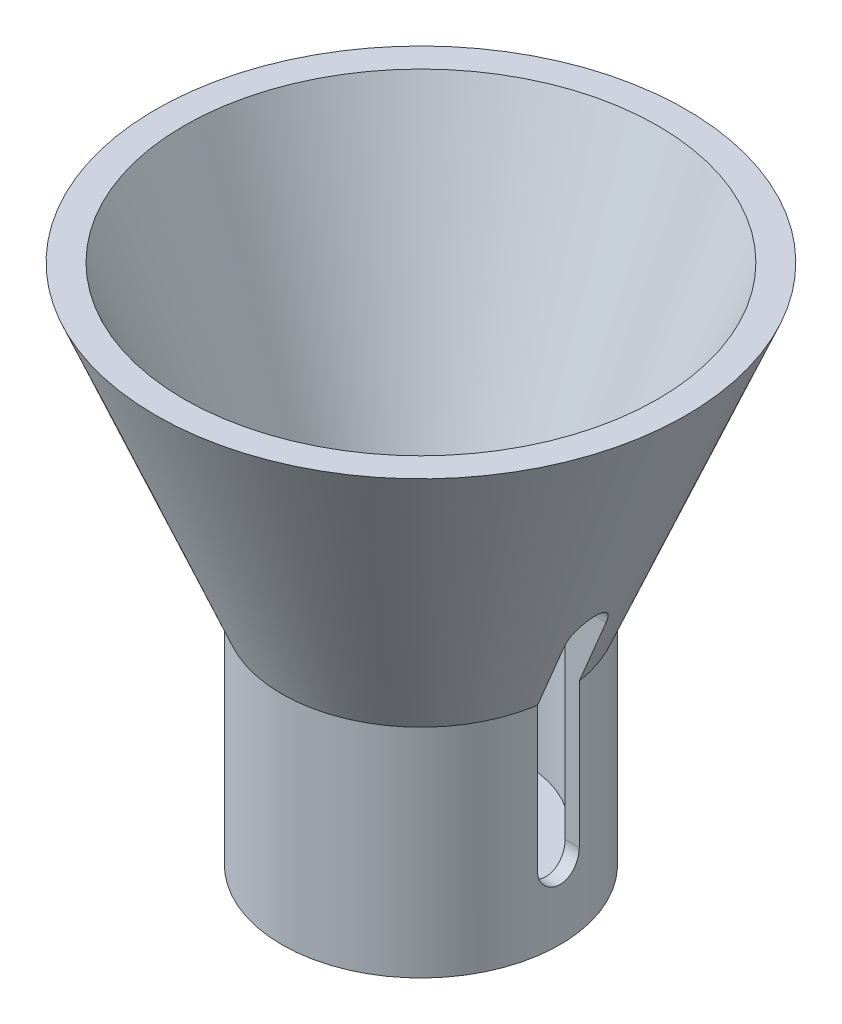
ISO-10303-21;
HEADER;
FILE_DESCRIPTION(('STEP AP214'),'2;1');
FILE_NAME('part.step','',(''),(''),'','','');
FILE_SCHEMA(('AUTOMOTIVE_DESIGN { 1 0 10303 214 1 1 1 1 }'));
ENDSEC;
DATA;
#1=APPLICATION_CONTEXT('core data for automotive mechanical design processes');
#2=APPLICATION_PROTOCOL_DEFINITION('international standard','automotive_design',2000,#1);
#3=PRODUCT_CONTEXT('',#1,'mechanical');
#4=PRODUCT('Part','Part','',(#3));
#5=PRODUCT_RELATED_PRODUCT_CATEGORY('part','',(#4));
#6=PRODUCT_DEFINITION_FORMATION('','',#4);
#7=PRODUCT_DEFINITION_CONTEXT('part definition',#1,'design');
#8=PRODUCT_DEFINITION('design','',#6,#7);
#9=PRODUCT_DEFINITION_SHAPE('','',#8);
#10=(LENGTH_UNIT() NAMED_UNIT(*) SI_UNIT(.MILLI.,.METRE.));
#11=(NAMED_UNIT(*) PLANE_ANGLE_UNIT() SI_UNIT($,.RADIAN.));
#12=(NAMED_UNIT(*) SI_UNIT($,.STERADIAN.) SOLID_ANGLE_UNIT());
#13=UNCERTAINTY_MEASURE_WITH_UNIT(LENGTH_MEASURE(1.E-05),#10,'distance_accuracy_value','');
#14=(GEOMETRIC_REPRESENTATION_CONTEXT(3) GLOBAL_UNCERTAINTY_ASSIGNED_CONTEXT((#13)) GLOBAL_UNIT_ASSIGNED_CONTEXT((#10,
#11,#12)) REPRESENTATION_CONTEXT('',''));
#15=CARTESIAN_POINT('',(0.,0.,0.));
#16=DIRECTION('',(0.,0.,1.));
#17=DIRECTION('',(1.,0.,0.));
#18=AXIS2_PLACEMENT_3D('',#15,#16,#17);
#19=CARTESIAN_POINT('',(0.,0.,0.));
#20=DIRECTION('',(0.,1.,0.));
#21=DIRECTION('',(0.,0.,1.));
#22=AXIS2_PLACEMENT_3D('',#19,#20,#21);
#23=CYLINDRICAL_SURFACE('',#22,25.4);
#24=CARTESIAN_POINT('',(0.,0.,0.));
#25=DIRECTION('',(0.,1.,0.));
#26=DIRECTION('',(0.,0.,1.));
#27=AXIS2_PLACEMENT_3D('',#24,#25,#26);
#28=CIRCLE('',#27,25.4);
#29=CARTESIAN_POINT('',(0.,0.,25.4));
#30=VERTEX_POINT('',#29);
#31=EDGE_CURVE('E168',#30,#30,#28,.T.);
#32=ORIENTED_EDGE('',*,*,#31,.T.);
#33=EDGE_LOOP('',(#32));
#34=FACE_BOUND('',#33,.T.);
#35=CARTESIAN_POINT('',(25.1126243152722,13.335,-3.81));
#36=CARTESIAN_POINT('',(25.1126175585665,13.228482253409,-3.8100109671057));
#37=CARTESIAN_POINT('',(25.1133018792106,13.1219702023658,-3.80553314885482));
#38=CARTESIAN_POINT('',(25.1160027078706,12.9097200866156,-3.78768492497283));
#39=CARTESIAN_POINT('',(25.1180190959609,12.8039819530995,-3.77431531986628));
#40=CARTESIAN_POINT('',(25.1233310167366,12.5941449704929,-3.73878915778813));
#41=CARTESIAN_POINT('',(25.1266250583201,12.490044357141,-3.71664284313557));
#42=CARTESIAN_POINT('',(25.1343913411075,12.2841261413494,-3.6637521666933));
#43=CARTESIAN_POINT('',(25.1388635785832,12.1823085316864,-3.63300783211093));
#44=CARTESIAN_POINT('',(25.153869699812,11.8812999731616,-3.52815848021347));
#45=CARTESIAN_POINT('',(25.1659965712694,11.6864212778861,-3.44141461372216));
#46=CARTESIAN_POINT('',(25.1931208471314,11.3140954951967,-3.23685558473287));
#47=CARTESIAN_POINT('',(25.2081181757162,11.1366479475466,-3.1190412428943));
#48=CARTESIAN_POINT('',(25.2394276197119,10.8026778550405,-2.85466141577451));
#49=CARTESIAN_POINT('',(25.2557482639284,10.6463117564339,-2.70789896873397));
#50=CARTESIAN_POINT('',(25.2877906513982,10.3603212145807,-2.39020596346059));
#51=CARTESIAN_POINT('',(25.3035123028248,10.2307008581683,-2.21927171841559));
#52=CARTESIAN_POINT('',(25.3326738380875,10.0013066284929,-1.85708123071595));
#53=CARTESIAN_POINT('',(25.3461024436064,9.90167853965665,-1.6657316603375));
#54=CARTESIAN_POINT('',(25.3690686102323,9.73604053615286,-1.26879129998832));
#55=CARTESIAN_POINT('',(25.3786066019802,9.67002690059706,-1.0632020891109));
#56=CARTESIAN_POINT('',(25.3926571506042,9.573963210953,-0.64524157134855));
#57=CARTESIAN_POINT('',(25.3972068034076,9.54364756104378,-0.432932576755672));
#58=CARTESIAN_POINT('',(25.4008952366483,9.51901579127942,-0.00619055995089375));
#59=CARTESIAN_POINT('',(25.400034188374,9.52469853181094,0.208242394807504));
#60=CARTESIAN_POINT('',(25.3930276825652,9.57169370689833,0.631321981584257));
#61=CARTESIAN_POINT('',(25.3869247512045,9.6127194201636,0.840001267224899));
#62=CARTESIAN_POINT('',(25.3701676365314,9.72878635171682,1.24747863651761));
#63=CARTESIAN_POINT('',(25.3595133632527,9.80382824240493,1.4462765247572));
#64=CARTESIAN_POINT('',(25.3347775014845,9.98608991725767,1.82921955414081));
#65=CARTESIAN_POINT('',(25.3206830330221,10.0934309884815,2.01330609579006));
#66=CARTESIAN_POINT('',(25.2906380206216,10.3371604846506,2.36095741188497));
#67=CARTESIAN_POINT('',(25.2746874275685,10.4735496783174,2.52452164305183));
#68=CARTESIAN_POINT('',(25.242526614067,10.7730458385729,2.82814951875782));
#69=CARTESIAN_POINT('',(25.2263153765868,10.9363994055563,2.96796951767498));
#70=CARTESIAN_POINT('',(25.1956016822528,11.2845422885358,3.21832825673773));
#71=CARTESIAN_POINT('',(25.1810997214388,11.4693377963563,3.32885850842518));
#72=CARTESIAN_POINT('',(25.1618698863102,11.7585638637956,3.4702375477801));
#73=CARTESIAN_POINT('',(25.1558746801563,11.8571058681013,3.51333218649192));
#74=CARTESIAN_POINT('',(25.1448976929978,12.0575173236808,3.59105368848347));
#75=CARTESIAN_POINT('',(25.1399155229308,12.1593854800155,3.62568380364914));
#76=CARTESIAN_POINT('',(25.131116212252,12.365612954469,3.68618109401866));
#77=CARTESIAN_POINT('',(25.1272978372465,12.4699695056285,3.71205755711846));
#78=CARTESIAN_POINT('',(25.1209319074453,12.6804935643652,3.75489681032431));
#79=CARTESIAN_POINT('',(25.1183837403769,12.7866601738746,3.77186389518983));
#80=CARTESIAN_POINT('',(25.1152180219579,12.9666853288155,3.79287468156852));
#81=CARTESIAN_POINT('',(25.1142459606468,13.0402685812568,3.79930025227018));
#82=CARTESIAN_POINT('',(25.112948972613,13.1875654559807,3.80786014226413));
#83=CARTESIAN_POINT('',(25.1126229581743,13.261278649639,3.81000167442953));
#84=CARTESIAN_POINT('',(25.1126243152722,13.335,3.81));
#85=B_SPLINE_CURVE_WITH_KNOTS('',3,(#35,#36,#37,#38,#39,#40,#41,#42,#43,#44,#45,#46,#47,#48,#49,
#50,#51,#52,#53,#54,#55,#56,#57,#58,#59,#60,#61,#62,#63,#64,#65,#66,#67,#68,#69,#70,#71,#72,#73,
#74,#75,#76,#77,#78,#79,#80,#81,#82,#83,#84),.UNSPECIFIED.,.F.,.F.,(4,2,2,2,2,2,2,2,2,2,2,2,2,2,
2,2,2,2,2,2,2,2,2,2,4),(0.,0.319446885208401,0.638865014614323,0.957911479231727,
1.27695693427829,1.91465099797754,2.55232822005397,3.19450393522069,3.83677770432803,
4.48212477796808,5.12740040059954,5.76784416400127,6.40826765275746,7.04354408711539,
7.6788330795747,8.31653807299431,8.95425994455941,9.59817489439409,10.2422762535582,
10.5651171802131,10.8878338827691,11.210207090987,11.5324247564369,11.753914111626,
11.9750302386737),.UNSPECIFIED.);
#86=CARTESIAN_POINT('',(25.1126243152722,13.335,-3.81));
#87=VERTEX_POINT('',#86);
#88=CARTESIAN_POINT('',(25.1126243152722,13.335,3.81));
#89=VERTEX_POINT('',#88);
#90=EDGE_CURVE('E215',#87,#89,#85,.T.);
#91=ORIENTED_EDGE('',*,*,#90,.T.);
#92=DIRECTION('',(0.,1.,0.));
#93=VECTOR('',#92,1.);
#94=CARTESIAN_POINT('',(25.1126243152722,0.,3.81));
#95=LINE('',#94,#93);
#96=CARTESIAN_POINT('',(25.1126243152722,39.6701158200871,3.81));
#97=VERTEX_POINT('',#96);
#98=EDGE_CURVE('E148',#89,#97,#95,.T.);
#99=ORIENTED_EDGE('',*,*,#98,.T.);
#100=CARTESIAN_POINT('',(0.,39.6701158200871,0.));
#101=DIRECTION('',(0.,1.,0.));
#102=DIRECTION('',(0.,0.,1.));
#103=AXIS2_PLACEMENT_3D('',#100,#101,#102);
#104=CIRCLE('',#103,25.4);
#105=CARTESIAN_POINT('',(25.1126243152722,39.6701158200871,-3.81));
#106=VERTEX_POINT('',#105);
#107=EDGE_CURVE('E165',#106,#97,#104,.T.);
#108=ORIENTED_EDGE('',*,*,#107,.F.);
#109=DIRECTION('',(0.,1.,0.));
#110=VECTOR('',#109,1.);
#111=CARTESIAN_POINT('',(25.1126243152722,0.,-3.81));
#112=LINE('',#111,#110);
#113=EDGE_CURVE('E57',#106,#87,#112,.F.);
#114=ORIENTED_EDGE('',*,*,#113,.T.);
#115=EDGE_LOOP('',(#91,#99,#108,#114));
#116=FACE_BOUND('',#115,.T.);
#117=ADVANCED_FACE('F35',(#34,#116),#23,.T.);
#118=CARTESIAN_POINT('',(0.,95.25,0.));
#119=DIRECTION('',(0.,1.,0.));
#120=DIRECTION('',(0.,0.,1.));
#121=AXIS2_PLACEMENT_3D('',#118,#119,#120);
#122=CONICAL_SURFACE('',#121,48.4219418224458,0.392699081698725);
#123=CARTESIAN_POINT('',(0.,95.25,0.));
#124=DIRECTION('',(0.,1.,0.));
#125=DIRECTION('',(0.,0.,1.));
#126=AXIS2_PLACEMENT_3D('',#123,#124,#125);
#127=CIRCLE('',#126,48.4219418224458);
#128=CARTESIAN_POINT('',(0.,95.25,48.4219418224458));
#129=VERTEX_POINT('',#128);
#130=EDGE_CURVE('E162',#129,#129,#127,.T.);
#131=ORIENTED_EDGE('',*,*,#130,.F.);
#132=EDGE_LOOP('',(#131));
#133=FACE_BOUND('',#132,.T.);
#134=ORIENTED_EDGE('',*,*,#107,.T.);
#135=CARTESIAN_POINT('',(12.0659898280624,8.8966890064032,3.81));
#136=CARTESIAN_POINT('',(12.3698130044374,9.59618201498557,3.81));
#137=CARTESIAN_POINT('',(12.6727907226718,10.2960414927165,3.81));
#138=CARTESIAN_POINT('',(13.277325500855,11.6963727615169,3.81));
#139=CARTESIAN_POINT('',(13.5788825626945,12.39684455177,3.81));
#140=CARTESIAN_POINT('',(14.1808457934142,13.7982786567903,3.81));
#141=CARTESIAN_POINT('',(14.4812519672602,14.4992409694256,3.81));
#142=CARTESIAN_POINT('',(15.081104257622,15.9015764987557,3.81));
#143=CARTESIAN_POINT('',(15.3805503737673,16.6029497156088,3.81));
#144=CARTESIAN_POINT('',(16.2776826745042,18.7075669549581,3.81));
#145=CARTESIAN_POINT('',(16.8741687954488,20.1113225161718,3.81));
#146=CARTESIAN_POINT('',(18.0648256522779,22.9198167487603,3.81));
#147=CARTESIAN_POINT('',(18.6589963850599,24.3245554214494,3.81));
#148=CARTESIAN_POINT('',(19.9827911962725,27.4596717603321,3.81));
#149=CARTESIAN_POINT('',(20.7119671340177,29.1902386188482,3.81));
#150=CARTESIAN_POINT('',(22.1684103307619,32.6521741088105,3.81));
#151=CARTESIAN_POINT('',(22.8956775905811,34.3835427399117,3.81));
#152=CARTESIAN_POINT('',(24.3487833401101,37.8468921023332,3.81));
#153=CARTESIAN_POINT('',(25.0746218208563,39.5788728374138,3.81));
#154=CARTESIAN_POINT('',(26.5251943634495,43.0432967684878,3.81));
#155=CARTESIAN_POINT('',(27.2499284252339,44.7757399645074,3.81));
#156=CARTESIAN_POINT('',(29.2867990850292,49.6481842542587,3.81));
#157=CARTESIAN_POINT('',(30.5979526283909,52.7885962785857,3.81));
#158=CARTESIAN_POINT('',(33.2183595253914,59.0702129975894,3.81));
#159=CARTESIAN_POINT('',(34.5276128789019,62.2114176923195,3.81));
#160=CARTESIAN_POINT('',(37.1447549945393,68.4943408552605,3.81));
#161=CARTESIAN_POINT('',(38.4526437765833,71.6360593151759,3.81));
#162=CARTESIAN_POINT('',(41.0674109310965,77.9199157844277,3.81));
#163=CARTESIAN_POINT('',(42.3742893038156,81.0620537936601,3.81));
#164=CARTESIAN_POINT('',(43.6808301789032,84.2043319947635,3.81));
#165=B_SPLINE_CURVE_WITH_KNOTS('',3,(#135,#136,#137,#138,#139,#140,#141,#142,#143,#144,#145,
#146,#147,#148,#149,#150,#151,#152,#153,#154,#155,#156,#157,#158,#159,#160,#161,#162,#163,#164),
.UNSPECIFIED.,.F.,.F.,(4,2,2,2,2,2,2,2,2,2,2,2,2,2,4),(0.,2.28787757676842,4.57575210794686,
6.86361675645749,9.15148228748975,13.7271678119536,18.3028594653324,23.9365983265766,
29.5703347667686,35.2041064394604,40.8378784315137,51.0472750723784,61.2566724021718,
71.4659185722867,81.675162216813),.UNSPECIFIED.);
#166=CARTESIAN_POINT('',(30.0324657592269,51.435,3.81));
#167=VERTEX_POINT('',#166);
#168=EDGE_CURVE('E299',#97,#167,#165,.T.);
#169=ORIENTED_EDGE('',*,*,#168,.T.);
#170=CARTESIAN_POINT('',(30.032382253198,51.4348,3.80999999475066));
#171=CARTESIAN_POINT('',(30.0811425556099,51.5515919814472,3.80999837791971));
#172=CARTESIAN_POINT('',(30.1304609923638,51.668075019492,3.80463967718518));
#173=CARTESIAN_POINT('',(30.229851689466,51.899733907372,3.78334178682402));
#174=CARTESIAN_POINT('',(30.2799238829781,52.0149098715365,3.76740352995615));
#175=CARTESIAN_POINT('',(30.4307543725306,52.3575055225426,3.70391268292035));
#176=CARTESIAN_POINT('',(30.5321130400097,52.5819606399924,3.64068408925704));
#177=CARTESIAN_POINT('',(30.7326244076113,53.016420549248,3.47411289661362));
#178=CARTESIAN_POINT('',(30.8317765061315,53.2264214321131,3.37075949624411));
#179=CARTESIAN_POINT('',(31.0239836071212,53.6261184680018,3.12568384170317));
#180=CARTESIAN_POINT('',(31.1170403676481,53.8158204858484,2.98397271198117));
#181=CARTESIAN_POINT('',(31.2475593897968,54.0779937063593,2.74667432234547));
#182=CARTESIAN_POINT('',(31.289136562605,54.1608447557468,2.66450853282227));
#183=CARTESIAN_POINT('',(31.369182080225,54.3193025222297,2.49210348908035));
#184=CARTESIAN_POINT('',(31.4076520573094,54.3949130468448,2.40186852695392));
#185=CARTESIAN_POINT('',(31.4809123863064,54.5380739042485,2.21382093756228));
#186=CARTESIAN_POINT('',(31.515702618093,54.6056239739113,2.11600806309506));
#187=CARTESIAN_POINT('',(31.5810005747909,54.7317895122666,1.91350342244088));
#188=CARTESIAN_POINT('',(31.6115109454281,54.7904105026821,1.80881596528054));
#189=CARTESIAN_POINT('',(31.664898899821,54.8925763853421,1.60406445922676));
#190=CARTESIAN_POINT('',(31.6882340067787,54.9370412517157,1.504578074159));
#191=CARTESIAN_POINT('',(31.7305861393965,55.017508280144,1.30140801596212));
#192=CARTESIAN_POINT('',(31.7496055765878,55.0535151687874,1.1977267252397));
#193=CARTESIAN_POINT('',(31.7829882545641,55.1165773765418,0.987004113305198));
#194=CARTESIAN_POINT('',(31.7973539547107,55.1436374239485,0.879964599728041));
#195=CARTESIAN_POINT('',(31.8211643918101,55.1884252165827,0.663415181650599));
#196=CARTESIAN_POINT('',(31.830609637251,55.2061539261282,0.553905533638863));
#197=CARTESIAN_POINT('',(31.8436225268953,55.2305631831457,0.345730051287656));
#198=CARTESIAN_POINT('',(31.8477276170388,55.2382542881774,0.247214853960122));
#199=CARTESIAN_POINT('',(31.8518385662251,55.2459563051919,0.0497650120115532));
#200=CARTESIAN_POINT('',(31.851843109353,55.2459647517169,-0.0491697570695918));
#201=CARTESIAN_POINT('',(31.8477482275267,55.2382929676859,-0.246599396088413));
#202=CARTESIAN_POINT('',(31.8436513098538,55.2306174344555,-0.345094497851252));
#203=CARTESIAN_POINT('',(31.8314298738105,55.2076922451557,-0.540957761941596));
#204=CARTESIAN_POINT('',(31.823303859302,55.1924397755128,-0.638325491883393));
#205=CARTESIAN_POINT('',(31.7938771233984,55.1371119556327,-0.919727818609641));
#206=CARTESIAN_POINT('',(31.7673278971552,55.0870989746694,-1.10138042698945));
#207=CARTESIAN_POINT('',(31.7012918908796,54.9619478792906,-1.45316185996964));
#208=CARTESIAN_POINT('',(31.6618030729373,54.8868058071523,-1.62328886425848));
#209=CARTESIAN_POINT('',(31.5695678961948,54.7098784905915,-1.95668318634228));
#210=CARTESIAN_POINT('',(31.5162604898595,54.6069553277943,-2.11919014134211));
#211=CARTESIAN_POINT('',(31.399936551321,54.3799882412313,-2.42475103384436));
#212=CARTESIAN_POINT('',(31.3369169398031,54.2559376175577,-2.56779877450664));
#213=CARTESIAN_POINT('',(31.1966726342465,53.9764064094208,-2.84607592648496));
#214=CARTESIAN_POINT('',(31.1186530619904,53.8190029944411,-2.97897224829889));
#215=CARTESIAN_POINT('',(30.9566839434304,53.4869177172648,-3.21675268987365));
#216=CARTESIAN_POINT('',(30.8727294670022,53.3122214405097,-3.3216131661518));
#217=CARTESIAN_POINT('',(30.69285926187,52.9310053811165,-3.51111517889541));
#218=CARTESIAN_POINT('',(30.5966015890605,52.7230606567864,-3.59256647572707));
#219=CARTESIAN_POINT('',(30.4036553109909,52.2965685995313,-3.71793927496701));
#220=CARTESIAN_POINT('',(30.3069674825683,52.0780362755617,-3.76191235110899));
#221=CARTESIAN_POINT('',(30.1814222216163,51.78704329142,-3.79435725600905));
#222=CARTESIAN_POINT('',(30.1513445360162,51.7167683362122,-3.80022318894743));
#223=CARTESIAN_POINT('',(30.0915722915746,51.5759670766816,-3.80804171281327));
#224=CARTESIAN_POINT('',(30.0618772138364,51.5054413264447,-3.81000031924081));
#225=CARTESIAN_POINT('',(30.032382253198,51.4348,-3.80999999475066));
#226=B_SPLINE_CURVE_WITH_KNOTS('',3,(#170,#171,#172,#173,#174,#175,#176,#177,#178,#179,#180,
#181,#182,#183,#184,#185,#186,#187,#188,#189,#190,#191,#192,#193,#194,#195,#196,#197,#198,#199,
#200,#201,#202,#203,#204,#205,#206,#207,#208,#209,#210,#211,#212,#213,#214,#215,#216,#217,#218,
#219,#220,#221,#222,#223,#224,#225),.UNSPECIFIED.,.F.,.F.,(4,2,2,2,2,2,2,2,2,2,2,2,2,2,2,2,2,2,
2,2,2,2,2,2,2,2,2,4),(0.,0.37943593816457,0.75883842736487,1.51774722594585,2.27686046064521,
3.03575377395,3.40695245090618,3.7779548439979,4.14896934480244,4.51975347134838,
4.85361574798852,5.18729100546392,5.52078963674068,5.85425379687524,6.15057921536798,
6.4469997282267,6.74323914560882,7.03958864905487,7.60762631078712,8.17575347815486,
8.77209761666755,9.36863122024236,10.0267709310608,10.6854639328579,11.4119270680793,
12.1373888967286,12.3673140153836,12.5968848802425),.UNSPECIFIED.);
#227=CARTESIAN_POINT('',(30.0324657592269,51.435,-3.81));
#228=VERTEX_POINT('',#227);
#229=EDGE_CURVE('E143',#167,#228,#226,.T.);
#230=ORIENTED_EDGE('',*,*,#229,.T.);
#231=CARTESIAN_POINT('',(43.6808301789032,84.2043319947635,-3.81));
#232=CARTESIAN_POINT('',(42.3742739497481,81.0620168955648,-3.81));
#233=CARTESIAN_POINT('',(41.0673802300013,77.9198419844708,-3.81));
#234=CARTESIAN_POINT('',(38.4525840377811,71.6359157695535,-3.81));
#235=CARTESIAN_POINT('',(37.1446815663587,68.4941644652931,-3.81));
#236=CARTESIAN_POINT('',(34.5275409964311,62.2112452372757,-3.81));
#237=CARTESIAN_POINT('',(33.2183029078101,59.070077309402,-3.81));
#238=CARTESIAN_POINT('',(30.597925120279,52.7885303018046,-3.81));
#239=CARTESIAN_POINT('',(29.2867854192255,49.6481512229747,-3.81));
#240=CARTESIAN_POINT('',(27.317947792094,44.9384507980857,-3.81));
#241=CARTESIAN_POINT('',(26.6613100897279,43.3686862546794,-3.81));
#242=CARTESIAN_POINT('',(25.3471476481617,40.2295287191875,-3.81));
#243=CARTESIAN_POINT('',(24.6896229090849,38.6601357270502,-3.81));
#244=CARTESIAN_POINT('',(23.3734557546736,35.5218234881397,-3.81));
#245=CARTESIAN_POINT('',(22.7148133424178,33.9529042400754,-3.81));
#246=CARTESIAN_POINT('',(21.3960836436533,30.8156719554761,-3.81));
#247=CARTESIAN_POINT('',(20.7359963563799,29.2473589192624,-3.81));
#248=CARTESIAN_POINT('',(19.4139041713624,26.1115212637043,-3.81));
#249=CARTESIAN_POINT('',(18.7518992530473,24.5439966530309,-3.81));
#250=CARTESIAN_POINT('',(17.4252972906605,21.4100465336399,-3.81));
#251=CARTESIAN_POINT('',(16.7607002503884,19.8436210233153,-3.81));
#252=CARTESIAN_POINT('',(15.7610406375795,17.4951502270351,-3.81));
#253=CARTESIAN_POINT('',(15.4273584580434,16.7125173945436,-3.81));
#254=CARTESIAN_POINT('',(14.7588712170109,15.1477317742866,-3.81));
#255=CARTESIAN_POINT('',(14.424066156053,14.3655789862912,-3.81));
#256=CARTESIAN_POINT('',(13.7530876500678,12.8018556804322,-3.81));
#257=CARTESIAN_POINT('',(13.4169141983229,12.0202851654494,-3.81));
#258=CARTESIAN_POINT('',(12.742838673328,10.4578885512247,-3.81));
#259=CARTESIAN_POINT('',(12.4049365972173,9.67706245321742,-3.81));
#260=CARTESIAN_POINT('',(12.0659898280624,8.8966890064032,-3.81));
#261=B_SPLINE_CURVE_WITH_KNOTS('',3,(#231,#232,#233,#234,#235,#236,#237,#238,#239,#240,#241,
#242,#243,#244,#245,#246,#247,#248,#249,#250,#251,#252,#253,#254,#255,#256,#257,#258,#259,#260),
.UNSPECIFIED.,.F.,.F.,(4,2,2,2,2,2,2,2,2,2,2,2,2,2,4),(0.,10.2093635416536,20.4187164599973,
30.6279943643427,40.8372837853049,45.9419877012796,51.0466909069465,56.1513800733624,
61.2560719417438,66.3608187739234,71.465558126339,74.0179526848814,76.5703460195558,
79.1227518994215,81.6751620046085),.UNSPECIFIED.);
#262=EDGE_CURVE('E291',#228,#106,#261,.T.);
#263=ORIENTED_EDGE('',*,*,#262,.T.);
#264=EDGE_LOOP('',(#134,#169,#230,#263));
#265=FACE_BOUND('',#264,.T.);
#266=ADVANCED_FACE('F202',(#133,#265),#122,.T.);
#267=CARTESIAN_POINT('',(0.,44.45,0.));
#268=DIRECTION('',(0.,1.,0.));
#269=DIRECTION('',(0.,0.,1.));
#270=AXIS2_PLACEMENT_3D('',#267,#268,#269);
#271=CONICAL_SURFACE('',#270,22.225,0.392699081698725);
#272=DIRECTION('',(-0.313475915937392,-0.923879532511286,0.219498199386555));
#273=VECTOR('',#272,1.);
#274=CARTESIAN_POINT('',(0.,-9.20589642374192,0.));
#275=LINE('',#274,#273);
#276=CARTESIAN_POINT('',(18.7258157324464,45.9830256121069,-13.1119573349849));
#277=VERTEX_POINT('',#276);
#278=CARTESIAN_POINT('',(18.2056541843229,44.45,-12.747736297902));
#279=VERTEX_POINT('',#278);
#280=EDGE_CURVE('E269',#277,#279,#275,.T.);
#281=ORIENTED_EDGE('',*,*,#280,.F.);
#282=CARTESIAN_POINT('',(0.,45.9830256121069,0.));
#283=DIRECTION('',(0.,1.,0.));
#284=DIRECTION('',(0.,0.,1.));
#285=AXIS2_PLACEMENT_3D('',#282,#283,#284);
#286=CIRCLE('',#285,22.86);
#287=CARTESIAN_POINT('',(22.5402639736095,45.9830256121069,-3.81));
#288=VERTEX_POINT('',#287);
#289=EDGE_CURVE('E316',#288,#277,#286,.T.);
#290=ORIENTED_EDGE('',*,*,#289,.F.);
#291=CARTESIAN_POINT('',(10.1781795340488,17.0315560562211,-3.81));
#292=CARTESIAN_POINT('',(10.4431174312636,17.6306307397453,-3.81));
#293=CARTESIAN_POINT('',(10.7070298639948,18.2301576081516,-3.81));
#294=CARTESIAN_POINT('',(11.2331369906596,19.4299628388328,-3.81));
#295=CARTESIAN_POINT('',(11.4953316891899,20.0302411990915,-3.81));
#296=CARTESIAN_POINT('',(12.018335719532,21.2313946182593,-3.81));
#297=CARTESIAN_POINT('',(12.2791450631549,21.8322696720292,-3.81));
#298=CARTESIAN_POINT('',(12.7996123886488,23.0345186317803,-3.81));
#299=CARTESIAN_POINT('',(13.059270369626,23.6358925381482,-3.81));
#300=CARTESIAN_POINT('',(13.8367995905656,25.4406091397565,-3.81));
#301=CARTESIAN_POINT('',(14.3532361845552,26.6445699017103,-3.81));
#302=CARTESIAN_POINT('',(15.3833545658379,29.053671937821,-3.81));
#303=CARTESIAN_POINT('',(15.8970363458412,30.2588132150918,-3.81));
#304=CARTESIAN_POINT('',(17.0392154885916,32.9448237036395,-3.81));
#305=CARTESIAN_POINT('',(17.6671895595238,34.4259153800632,-3.81));
#306=CARTESIAN_POINT('',(18.9208908721615,37.3890473181502,-3.81));
#307=CARTESIAN_POINT('',(19.5466181157941,38.8710875789986,-3.81));
#308=CARTESIAN_POINT('',(20.7963957789249,41.8358958309319,-3.81));
#309=CARTESIAN_POINT('',(21.4204461781155,43.3186638305752,-3.81));
#310=CARTESIAN_POINT('',(22.6672507263872,46.2847447701705,-3.81));
#311=CARTESIAN_POINT('',(23.2900048753298,47.7680577101807,-3.81));
#312=CARTESIAN_POINT('',(25.0412086156598,51.9431575840395,-3.81));
#313=CARTESIAN_POINT('',(26.1685016934142,54.6354295661975,-3.81));
#314=CARTESIAN_POINT('',(28.4208585445553,60.0209058622793,-3.81));
#315=CARTESIAN_POINT('',(29.5459223176734,62.7141101763154,-3.81));
#316=CARTESIAN_POINT('',(31.7944414404446,68.1011001550242,-3.81));
#317=CARTESIAN_POINT('',(32.9178968349082,70.7948858009959,-3.81));
#318=CARTESIAN_POINT('',(35.1636242714058,76.1829488955874,-3.81));
#319=CARTESIAN_POINT('',(36.2858963139817,78.8772263439814,-3.81));
#320=CARTESIAN_POINT('',(37.4077737069211,81.5716678905446,-3.81));
#321=B_SPLINE_CURVE_WITH_KNOTS('',3,(#291,#292,#293,#294,#295,#296,#297,#298,#299,#300,#301,
#302,#303,#304,#305,#306,#307,#308,#309,#310,#311,#312,#313,#314,#315,#316,#317,#318,#319,#320),
.UNSPECIFIED.,.F.,.F.,(4,2,2,2,2,2,2,2,2,2,2,2,2,2,4),(0.,1.96512912095278,3.93025298096885,
5.89536006008503,7.86046866416634,11.7906100353792,15.7207618015011,20.5469227097222,
25.3730794773586,30.1992944313073,35.0255099009494,43.7817666777612,52.5380245092395,
61.2940334429785,70.0500383651763),.UNSPECIFIED.);
#322=CARTESIAN_POINT('',(24.8276454225367,51.435,-3.81));
#323=VERTEX_POINT('',#322);
#324=EDGE_CURVE('E287',#288,#323,#321,.T.);
#325=ORIENTED_EDGE('',*,*,#324,.T.);
#326=CARTESIAN_POINT('',(24.8275616108567,51.4348,-3.80999999475066));
#327=CARTESIAN_POINT('',(24.8767036381556,51.552078855119,-3.80999813396109));
#328=CARTESIAN_POINT('',(24.9265294054046,51.6689922335449,-3.80459505206404));
#329=CARTESIAN_POINT('',(25.0271584684205,51.9013966034157,-3.78314871481135));
#330=CARTESIAN_POINT('',(25.0779616305175,52.0168877858685,-3.76710690452017));
#331=CARTESIAN_POINT('',(25.2312662267875,52.3602241771854,-3.70326722823736));
#332=CARTESIAN_POINT('',(25.3346692046962,52.584947522736,-3.63975507487046));
#333=CARTESIAN_POINT('',(25.5398196302412,53.0196084209584,-3.47267093881345));
#334=CARTESIAN_POINT('',(25.6415670102424,53.2295453707316,-3.36909732377883));
#335=CARTESIAN_POINT('',(25.8393146742269,53.6290528549755,-3.123628163649));
#336=CARTESIAN_POINT('',(25.9353158039341,53.8186263897807,-2.98173827490778));
#337=CARTESIAN_POINT('',(26.0704664725298,54.0810664884514,-2.74373917073764));
#338=CARTESIAN_POINT('',(26.1137029828523,54.1642622663719,-2.66103645471457));
#339=CARTESIAN_POINT('',(26.1970023582303,54.3233492776834,-2.4874429872869));
#340=CARTESIAN_POINT('',(26.2370669092084,54.3992443961107,-2.39655664120535));
#341=CARTESIAN_POINT('',(26.3133960701939,54.5428966305911,-2.20708358724539));
#342=CARTESIAN_POINT('',(26.3496607848111,54.6106539706852,-2.10849709148297));
#343=CARTESIAN_POINT('',(26.4177297185994,54.7371358887334,-1.90431221768202));
#344=CARTESIAN_POINT('',(26.4495367938484,54.7958662527648,-1.79871839385269));
#345=CARTESIAN_POINT('',(26.5050280117204,54.8978694328549,-1.59262209741404));
#346=CARTESIAN_POINT('',(26.5292131941879,54.9421152092738,-1.49273537985972));
#347=CARTESIAN_POINT('',(26.5730767344544,55.0221032312572,-1.28871473223165));
#348=CARTESIAN_POINT('',(26.5927576874563,55.0578503739446,-1.18458328879856));
#349=CARTESIAN_POINT('',(26.6272399759174,55.1203325994332,-0.972929547197731));
#350=CARTESIAN_POINT('',(26.6420442416751,55.1470730943572,-0.865409327990663));
#351=CARTESIAN_POINT('',(26.6664832629865,55.191149226394,-0.647883561317552));
#352=CARTESIAN_POINT('',(26.6761186207772,55.2084859591556,-0.537878304943893));
#353=CARTESIAN_POINT('',(26.6891767744015,55.23196518579,-0.329790207161529));
#354=CARTESIAN_POINT('',(26.6932081580256,55.2392046387332,-0.231867575762583));
#355=CARTESIAN_POINT('',(26.6970469537134,55.2460983950212,-0.0356388819144666));
#356=CARTESIAN_POINT('',(26.6968530237604,55.2457502884547,0.0626672924407929));
#357=CARTESIAN_POINT('',(26.6922399144148,55.2374656455259,0.258803004691066));
#358=CARTESIAN_POINT('',(26.6878233486537,55.2295338031726,0.356632799799677));
#359=CARTESIAN_POINT('',(26.6748501297352,55.2062023926774,0.551131392166012));
#360=CARTESIAN_POINT('',(26.6662919347278,55.1908000434028,0.647799743293938));
#361=CARTESIAN_POINT('',(26.63551737859,55.1353090619369,0.926579712206712));
#362=CARTESIAN_POINT('',(26.6079613924624,55.0855145500406,1.10628719137205));
#363=CARTESIAN_POINT('',(26.5397358934767,54.9614049257713,1.45422581726259));
#364=CARTESIAN_POINT('',(26.4990641453858,54.8870856337511,1.62245500189246));
#365=CARTESIAN_POINT('',(26.4040971916096,54.7120084201433,1.95298769919643));
#366=CARTESIAN_POINT('',(26.3491773896153,54.6100245067328,2.11446083485313));
#367=CARTESIAN_POINT('',(26.2295789709566,54.3853197056282,2.41814970580209));
#368=CARTESIAN_POINT('',(26.1648970435808,54.2625917811438,2.56035887677825));
#369=CARTESIAN_POINT('',(26.0206576250397,53.9850599583578,2.83831598221389));
#370=CARTESIAN_POINT('',(25.9402456049197,53.8282048931963,2.97157160452065));
#371=CARTESIAN_POINT('',(25.7736306966046,53.4971724615272,3.21017674873096));
#372=CARTESIAN_POINT('',(25.6874227514834,53.3229799027578,3.31550149433374));
#373=CARTESIAN_POINT('',(25.5026184300333,52.9415832537876,3.50665559227313));
#374=CARTESIAN_POINT('',(25.4036944706799,52.7328493470597,3.58911842309043));
#375=CARTESIAN_POINT('',(25.2060121855785,52.3043255104319,3.71620521358465));
#376=CARTESIAN_POINT('',(25.1072538255528,52.0845518461112,3.76088320658831));
#377=CARTESIAN_POINT('',(24.9793849566493,51.7912913192155,3.7939757079863));
#378=CARTESIAN_POINT('',(24.9486850212371,51.7202011198454,3.79998286037524));
#379=CARTESIAN_POINT('',(24.88776103889,51.5777194720564,3.80799216658328));
#380=CARTESIAN_POINT('',(24.8575363457737,51.5063286373739,3.8100003291764));
#381=CARTESIAN_POINT('',(24.8275616108567,51.4348,3.80999999475066));
#382=B_SPLINE_CURVE_WITH_KNOTS('',3,(#326,#327,#328,#329,#330,#331,#332,#333,#334,#335,#336,
#337,#338,#339,#340,#341,#342,#343,#344,#345,#346,#347,#348,#349,#350,#351,#352,#353,#354,#355,
#356,#357,#358,#359,#360,#361,#362,#363,#364,#365,#366,#367,#368,#369,#370,#371,#372,#373,#374,
#375,#376,#377,#378,#379,#380,#381),.UNSPECIFIED.,.F.,.F.,(4,2,2,2,2,2,2,2,2,2,2,2,2,2,2,2,2,2,
2,2,2,2,2,2,2,2,2,4),(0.,0.381219294902926,0.762386819177575,1.52467272413199,2.28698969246417,
3.04919418692433,3.42383948265593,3.79828429551105,4.17271879717269,4.54691228524324,
4.88211980921619,5.21713370761814,5.55194593446947,5.88671914337945,6.18116234420819,
6.47569906553234,6.77005359912646,7.06451779972844,7.62729037551732,8.19015891166434,
8.7838830668137,9.37780903096135,10.0380184620304,10.6988115927136,11.431477941025,
12.1630947767039,12.3960243273847,12.6286036195319),.UNSPECIFIED.);
#383=CARTESIAN_POINT('',(24.8276454225367,51.435,3.81));
#384=VERTEX_POINT('',#383);
#385=EDGE_CURVE('E43',#323,#384,#382,.T.);
#386=ORIENTED_EDGE('',*,*,#385,.T.);
#387=CARTESIAN_POINT('',(37.4077737069211,81.5716678905446,3.81));
#388=CARTESIAN_POINT('',(36.2858710652025,78.8771657400801,3.81));
#389=CARTESIAN_POINT('',(35.1635737748235,76.182827686031,3.81));
#390=CARTESIAN_POINT('',(32.9177985658825,70.7946500873642,3.81));
#391=CARTESIAN_POINT('',(31.7943206497123,68.1008105417496,3.81));
#392=CARTESIAN_POINT('',(29.5458040571782,62.7138270708291,3.81));
#393=CARTESIAN_POINT('',(28.4207654028747,60.0206831363166,3.81));
#394=CARTESIAN_POINT('',(26.1684564058923,54.6353213032723,3.81));
#395=CARTESIAN_POINT('',(25.0411860583501,51.9431034067735,3.81));
#396=CARTESIAN_POINT('',(23.3477759858044,47.9057918291259,3.81));
#397=CARTESIAN_POINT('',(22.7828822429491,46.5601755617525,3.81));
#398=CARTESIAN_POINT('',(21.6520510517253,43.8693820069634,3.81));
#399=CARTESIAN_POINT('',(21.0861136036435,42.5242047194271,3.81));
#400=CARTESIAN_POINT('',(19.9529226314695,39.8344129214294,3.81));
#401=CARTESIAN_POINT('',(19.3856691144028,38.4897984080088,3.81));
#402=CARTESIAN_POINT('',(18.2494564015604,35.8012883141089,3.81));
#403=CARTESIAN_POINT('',(17.6804972040073,34.4573927343804,3.81));
#404=CARTESIAN_POINT('',(16.5403066638553,31.7705326979973,3.81));
#405=CARTESIAN_POINT('',(15.9690752745095,30.427568261174,3.81));
#406=CARTESIAN_POINT('',(14.82353698586,27.7429548731884,3.81));
#407=CARTESIAN_POINT('',(14.2492300954258,26.4013059182456,3.81));
#408=CARTESIAN_POINT('',(13.3844737836682,24.3902345798097,3.81));
#409=CARTESIAN_POINT('',(13.0956696023218,23.7201048156147,3.81));
#410=CARTESIAN_POINT('',(12.5167187933386,22.3804260263536,3.81));
#411=CARTESIAN_POINT('',(12.2265721669902,21.7108770007307,3.81));
#412=CARTESIAN_POINT('',(11.644636959998,20.372484585673,3.81));
#413=CARTESIAN_POINT('',(11.3528483634928,19.703641203129,3.81));
#414=CARTESIAN_POINT('',(10.7671874265677,18.366864993571,3.81));
#415=CARTESIAN_POINT('',(10.4733150792493,17.6989321695802,3.81));
#416=CARTESIAN_POINT('',(10.1781795340488,17.0315560562211,3.81));
#417=B_SPLINE_CURVE_WITH_KNOTS('',3,(#387,#388,#389,#390,#391,#392,#393,#394,#395,#396,#397,
#398,#399,#400,#401,#402,#403,#404,#405,#406,#407,#408,#409,#410,#411,#412,#413,#414,#415,#416),
.UNSPECIFIED.,.F.,.F.,(4,2,2,2,2,2,2,2,2,2,2,2,2,2,4),(0.,8.75620188406558,17.5123860637498,
26.2684477133448,35.0245284642441,39.4026661784432,43.7808026900027,48.1589158838266,
52.5370336412646,56.9152419424761,61.2934376242303,63.482576890014,65.6717140550931,
67.8608724037596,70.0500380034197),.UNSPECIFIED.);
#418=CARTESIAN_POINT('',(22.5402639736095,45.9830256121069,3.81));
#419=VERTEX_POINT('',#418);
#420=EDGE_CURVE('E222',#384,#419,#417,.T.);
#421=ORIENTED_EDGE('',*,*,#420,.T.);
#422=CARTESIAN_POINT('',(18.7258157324463,45.9830256121069,13.111957334985));
#423=VERTEX_POINT('',#422);
#424=EDGE_CURVE('E310',#423,#419,#286,.T.);
#425=ORIENTED_EDGE('',*,*,#424,.F.);
#426=DIRECTION('',(0.313475915937391,0.923879532511286,0.219498199386557));
#427=VECTOR('',#426,1.);
#428=CARTESIAN_POINT('',(0.,-9.20589642374192,0.));
#429=LINE('',#428,#427);
#430=CARTESIAN_POINT('',(18.2056541843228,44.45,12.7477362979021));
#431=VERTEX_POINT('',#430);
#432=EDGE_CURVE('E322',#431,#423,#429,.T.);
#433=ORIENTED_EDGE('',*,*,#432,.F.);
#434=CARTESIAN_POINT('',(0.,44.45,0.));
#435=DIRECTION('',(0.,1.,0.));
#436=DIRECTION('',(0.,0.,1.));
#437=AXIS2_PLACEMENT_3D('',#434,#435,#436);
#438=CIRCLE('',#437,22.225);
#439=EDGE_CURVE('E145',#279,#431,#438,.T.);
#440=ORIENTED_EDGE('',*,*,#439,.F.);
#441=EDGE_LOOP('',(#281,#290,#325,#386,#421,#425,#433,#440));
#442=FACE_BOUND('',#441,.T.);
#443=CARTESIAN_POINT('',(0.,95.25,0.));
#444=DIRECTION('',(0.,1.,0.));
#445=DIRECTION('',(0.,0.,1.));
#446=AXIS2_PLACEMENT_3D('',#443,#444,#445);
#447=CIRCLE('',#446,43.2670489685533);
#448=CARTESIAN_POINT('',(0.,95.25,43.2670489685533));
#449=VERTEX_POINT('',#448);
#450=EDGE_CURVE('E159',#449,#449,#447,.T.);
#451=ORIENTED_EDGE('',*,*,#450,.T.);
#452=EDGE_LOOP('',(#451));
#453=FACE_BOUND('',#452,.T.);
#454=ADVANCED_FACE('F177',(#442,#453),#271,.F.);
#455=CARTESIAN_POINT('',(-22.225,44.45,0.));
#456=DIRECTION('',(0.,1.,0.));
#457=DIRECTION('',(0.,0.,1.));
#458=AXIS2_PLACEMENT_3D('',#455,#456,#457);
#459=PLANE('',#458);
#460=DIRECTION('',(-0.819152044288993,0.,0.573576436351044));
#461=VECTOR('',#460,1.);
#462=CARTESIAN_POINT('',(-14.9131988427065,44.45,10.4423342484834));
#463=LINE('',#462,#461);
#464=CARTESIAN_POINT('',(15.6048464437053,44.45,-10.9266311124874));
#465=VERTEX_POINT('',#464);
#466=EDGE_CURVE('E272',#279,#465,#463,.T.);
#467=ORIENTED_EDGE('',*,*,#466,.F.);
#468=ORIENTED_EDGE('',*,*,#439,.T.);
#469=DIRECTION('',(0.819152044288989,0.,0.57357643635105));
#470=VECTOR('',#469,1.);
#471=CARTESIAN_POINT('',(-14.9131988427064,44.45,-10.4423342484834));
#472=LINE('',#471,#470);
#473=CARTESIAN_POINT('',(15.6048464437052,44.45,10.9266311124875));
#474=VERTEX_POINT('',#473);
#475=EDGE_CURVE('E319',#474,#431,#472,.T.);
#476=ORIENTED_EDGE('',*,*,#475,.F.);
#477=CARTESIAN_POINT('',(0.,44.45,0.));
#478=DIRECTION('',(0.,1.,0.));
#479=DIRECTION('',(0.,0.,1.));
#480=AXIS2_PLACEMENT_3D('',#477,#478,#479);
#481=CIRCLE('',#480,19.05);
#482=EDGE_CURVE('E137',#465,#474,#481,.T.);
#483=ORIENTED_EDGE('',*,*,#482,.F.);
#484=EDGE_LOOP('',(#467,#468,#476,#483));
#485=FACE_BOUND('',#484,.T.);
#486=ADVANCED_FACE('F196',(#485),#459,.T.);
#487=CARTESIAN_POINT('',(0.,0.,0.));
#488=DIRECTION('',(0.,1.,0.));
#489=DIRECTION('',(0.,0.,1.));
#490=AXIS2_PLACEMENT_3D('',#487,#488,#489);
#491=CYLINDRICAL_SURFACE('',#490,19.05);
#492=DIRECTION('',(0.,1.,0.));
#493=VECTOR('',#492,1.);
#494=CARTESIAN_POINT('',(15.6048464437053,6.35000000000001,-10.9266311124874));
#495=LINE('',#494,#493);
#496=CARTESIAN_POINT('',(15.6048464437053,6.35000000000001,-10.9266311124874));
#497=VERTEX_POINT('',#496);
#498=EDGE_CURVE('E244',#497,#465,#495,.T.);
#499=ORIENTED_EDGE('',*,*,#498,.T.);
#500=ORIENTED_EDGE('',*,*,#482,.T.);
#501=DIRECTION('',(0.,1.,0.));
#502=VECTOR('',#501,1.);
#503=CARTESIAN_POINT('',(15.6048464437052,6.35000000000001,10.9266311124875));
#504=LINE('',#503,#502);
#505=CARTESIAN_POINT('',(15.6048464437052,6.35000000000001,10.9266311124875));
#506=VERTEX_POINT('',#505);
#507=EDGE_CURVE('E120',#506,#474,#504,.T.);
#508=ORIENTED_EDGE('',*,*,#507,.F.);
#509=CARTESIAN_POINT('',(0.,6.35,0.));
#510=DIRECTION('',(0.,1.,0.));
#511=DIRECTION('',(0.,0.,1.));
#512=AXIS2_PLACEMENT_3D('',#509,#510,#511);
#513=CIRCLE('',#512,19.05);
#514=EDGE_CURVE('E135',#497,#506,#513,.T.);
#515=ORIENTED_EDGE('',*,*,#514,.F.);
#516=EDGE_LOOP('',(#499,#500,#508,#515));
#517=FACE_BOUND('',#516,.T.);
#518=ADVANCED_FACE('F134',(#517),#491,.F.);
#519=CARTESIAN_POINT('',(0.,0.,0.));
#520=DIRECTION('',(0.,-1.,0.));
#521=DIRECTION('',(0.,0.,-1.));
#522=AXIS2_PLACEMENT_3D('',#519,#520,#521);
#523=PLANE('',#522);
#524=CARTESIAN_POINT('',(0.,0.,0.));
#525=DIRECTION('',(0.,-1.,0.));
#526=DIRECTION('',(0.,0.,-1.));
#527=AXIS2_PLACEMENT_3D('',#524,#525,#526);
#528=CIRCLE('',#527,3.26389999999999);
#529=CARTESIAN_POINT('',(0.,0.,-3.26389999999999));
#530=VERTEX_POINT('',#529);
#531=EDGE_CURVE('E267',#530,#530,#528,.T.);
#532=ORIENTED_EDGE('',*,*,#531,.F.);
#533=EDGE_LOOP('',(#532));
#534=FACE_BOUND('',#533,.T.);
#535=ORIENTED_EDGE('',*,*,#31,.F.);
#536=EDGE_LOOP('',(#535));
#537=FACE_BOUND('',#536,.T.);
#538=ADVANCED_FACE('F37',(#534,#537),#523,.T.);
#539=CARTESIAN_POINT('',(-48.4219418224458,95.25,0.));
#540=DIRECTION('',(0.,1.,0.));
#541=DIRECTION('',(0.,0.,1.));
#542=AXIS2_PLACEMENT_3D('',#539,#540,#541);
#543=PLANE('',#542);
#544=ORIENTED_EDGE('',*,*,#130,.T.);
#545=EDGE_LOOP('',(#544));
#546=FACE_BOUND('',#545,.T.);
#547=ORIENTED_EDGE('',*,*,#450,.F.);
#548=EDGE_LOOP('',(#547));
#549=FACE_BOUND('',#548,.T.);
#550=ADVANCED_FACE('F193',(#546,#549),#543,.T.);
#551=CARTESIAN_POINT('',(-19.05,6.35,0.));
#552=DIRECTION('',(0.,1.,0.));
#553=DIRECTION('',(0.,0.,1.));
#554=AXIS2_PLACEMENT_3D('',#551,#552,#553);
#555=PLANE('',#554);
#556=CARTESIAN_POINT('',(0.,6.35,0.));
#557=DIRECTION('',(0.,1.,0.));
#558=DIRECTION('',(0.,0.,1.));
#559=AXIS2_PLACEMENT_3D('',#556,#557,#558);
#560=CIRCLE('',#559,3.26389999999998);
#561=CARTESIAN_POINT('',(0.,6.35,3.26389999999998));
#562=VERTEX_POINT('',#561);
#563=EDGE_CURVE('E176',#562,#562,#560,.T.);
#564=ORIENTED_EDGE('',*,*,#563,.F.);
#565=EDGE_LOOP('',(#564));
#566=FACE_BOUND('',#565,.T.);
#567=ORIENTED_EDGE('',*,*,#514,.T.);
#568=DIRECTION('',(0.819152044288989,0.,0.57357643635105));
#569=VECTOR('',#568,1.);
#570=CARTESIAN_POINT('',(15.6048464437052,6.35000000000001,10.9266311124875));
#571=LINE('',#570,#569);
#572=CARTESIAN_POINT('',(18.7258157324463,6.35000000000001,13.111957334985));
#573=VERTEX_POINT('',#572);
#574=EDGE_CURVE('E117',#506,#573,#571,.T.);
#575=ORIENTED_EDGE('',*,*,#574,.T.);
#576=CARTESIAN_POINT('',(0.,6.35000000000001,0.));
#577=DIRECTION('',(0.,1.,0.));
#578=DIRECTION('',(0.,0.,-1.));
#579=AXIS2_PLACEMENT_3D('',#576,#577,#578);
#580=CIRCLE('',#579,22.86);
#581=CARTESIAN_POINT('',(18.7258157324464,6.35000000000001,-13.1119573349849));
#582=VERTEX_POINT('',#581);
#583=EDGE_CURVE('E128',#573,#582,#580,.T.);
#584=ORIENTED_EDGE('',*,*,#583,.T.);
#585=DIRECTION('',(-0.819152044288993,0.,0.573576436351044));
#586=VECTOR('',#585,1.);
#587=CARTESIAN_POINT('',(15.6048464437053,6.35000000000001,-10.9266311124874));
#588=LINE('',#587,#586);
#589=EDGE_CURVE('E138',#582,#497,#588,.T.);
#590=ORIENTED_EDGE('',*,*,#589,.T.);
#591=EDGE_LOOP('',(#567,#575,#584,#590));
#592=FACE_BOUND('',#591,.T.);
#593=ADVANCED_FACE('F141',(#566,#592),#555,.T.);
#594=CARTESIAN_POINT('',(48.4219418224458,51.435,0.));
#595=DIRECTION('',(-1.,0.,0.));
#596=DIRECTION('',(0.,0.,1.));
#597=AXIS2_PLACEMENT_3D('',#594,#595,#596);
#598=CYLINDRICAL_SURFACE('',#597,3.81);
#599=DIRECTION('',(-1.,0.,0.));
#600=VECTOR('',#599,1.);
#601=CARTESIAN_POINT('',(48.4219418224458,51.435,3.81));
#602=LINE('',#601,#600);
#603=EDGE_CURVE('E284',#167,#384,#602,.T.);
#604=ORIENTED_EDGE('',*,*,#603,.T.);
#605=ORIENTED_EDGE('',*,*,#385,.F.);
#606=DIRECTION('',(-1.,0.,0.));
#607=VECTOR('',#606,1.);
#608=CARTESIAN_POINT('',(48.4219418224458,51.435,-3.81));
#609=LINE('',#608,#607);
#610=EDGE_CURVE('E271',#228,#323,#609,.T.);
#611=ORIENTED_EDGE('',*,*,#610,.F.);
#612=ORIENTED_EDGE('',*,*,#229,.F.);
#613=EDGE_LOOP('',(#604,#605,#611,#612));
#614=FACE_BOUND('',#613,.T.);
#615=ADVANCED_FACE('F181',(#614),#598,.F.);
#616=CARTESIAN_POINT('',(48.4219418224458,51.435,3.81));
#617=DIRECTION('',(0.,0.,-1.));
#618=DIRECTION('',(0.,1.,0.));
#619=AXIS2_PLACEMENT_3D('',#616,#617,#618);
#620=PLANE('',#619);
#621=DIRECTION('',(0.,1.,0.));
#622=VECTOR('',#621,1.);
#623=CARTESIAN_POINT('',(22.5402639736095,6.35000000000001,3.81));
#624=LINE('',#623,#622);
#625=CARTESIAN_POINT('',(22.5402639736095,13.335,3.81));
#626=VERTEX_POINT('',#625);
#627=EDGE_CURVE('E243',#419,#626,#624,.F.);
#628=ORIENTED_EDGE('',*,*,#627,.F.);
#629=ORIENTED_EDGE('',*,*,#420,.F.);
#630=ORIENTED_EDGE('',*,*,#603,.F.);
#631=ORIENTED_EDGE('',*,*,#168,.F.);
#632=ORIENTED_EDGE('',*,*,#98,.F.);
#633=DIRECTION('',(-1.,0.,0.));
#634=VECTOR('',#633,1.);
#635=CARTESIAN_POINT('',(48.4219418224458,13.335,3.81));
#636=LINE('',#635,#634);
#637=EDGE_CURVE('E281',#89,#626,#636,.T.);
#638=ORIENTED_EDGE('',*,*,#637,.T.);
#639=EDGE_LOOP('',(#628,#629,#630,#631,#632,#638));
#640=FACE_BOUND('',#639,.T.);
#641=ADVANCED_FACE('F186',(#640),#620,.T.);
#642=CARTESIAN_POINT('',(48.4219418224458,13.335,0.));
#643=DIRECTION('',(-1.,0.,0.));
#644=DIRECTION('',(0.,0.,1.));
#645=AXIS2_PLACEMENT_3D('',#642,#643,#644);
#646=CYLINDRICAL_SURFACE('',#645,3.81);
#647=CARTESIAN_POINT('',(22.5402639736095,13.335,3.81));
#648=CARTESIAN_POINT('',(22.5402564222912,13.2286334335928,3.81001113114397));
#649=CARTESIAN_POINT('',(22.541016719846,13.1222727607797,3.80554583218761));
#650=CARTESIAN_POINT('',(22.5440171479428,12.9103271721225,3.78774865432249));
#651=CARTESIAN_POINT('',(22.5462571303626,12.8047421796993,3.77441766290346));
#652=CARTESIAN_POINT('',(22.552157331636,12.595223584252,3.73899787574132));
#653=CARTESIAN_POINT('',(22.5558157414421,12.4912880525791,3.71692023460467));
#654=CARTESIAN_POINT('',(22.5644402289303,12.285698786592,3.66419764637376));
#655=CARTESIAN_POINT('',(22.5694063053006,12.1840450499889,3.6335527078742));
#656=CARTESIAN_POINT('',(22.5860671591925,11.8835327288702,3.52905408716205));
#657=CARTESIAN_POINT('',(22.5995288464434,11.6889809969223,3.44261241904754));
#658=CARTESIAN_POINT('',(22.6296348648052,11.3172436247657,3.23879087511131));
#659=CARTESIAN_POINT('',(22.6462792373258,11.1400582105536,3.12141059674347));
#660=CARTESIAN_POINT('',(22.6810581032966,10.8062236868272,2.85779421344216));
#661=CARTESIAN_POINT('',(22.699204315284,10.6497669356995,2.71131562795409));
#662=CARTESIAN_POINT('',(22.7348396034127,10.3635249380197,2.39417682418608));
#663=CARTESIAN_POINT('',(22.7523285784785,10.2337437802619,2.22351290557807));
#664=CARTESIAN_POINT('',(22.7848022838305,10.0038159264958,1.86159582983821));
#665=CARTESIAN_POINT('',(22.7997714915703,9.90385018616719,1.67022618720623));
#666=CARTESIAN_POINT('',(22.8253865640177,9.73756193483795,1.27313115249275));
#667=CARTESIAN_POINT('',(22.8360329554149,9.67123532501727,1.0674075128763));
#668=CARTESIAN_POINT('',(22.8517205429537,9.57469439177822,0.64944553286995));
#669=CARTESIAN_POINT('',(22.8568124814793,9.54415296092807,0.437284684359812));
#670=CARTESIAN_POINT('',(22.8609918295873,9.51903226389554,0.0107878283538196));
#671=CARTESIAN_POINT('',(22.8600795048842,9.52445140630312,-0.203548082467036));
#672=CARTESIAN_POINT('',(22.8523930721048,9.57084401247638,-0.626063188507675));
#673=CARTESIAN_POINT('',(22.8456771626074,9.61146448724898,-0.834282353326843));
#674=CARTESIAN_POINT('',(22.82720311511,9.72655127538527,-1.24090610635389));
#675=CARTESIAN_POINT('',(22.8154448556916,9.80101840377034,-1.43931045809525));
#676=CARTESIAN_POINT('',(22.7881080944393,9.9820344109236,-1.82172610546373));
#677=CARTESIAN_POINT('',(22.7725122673042,10.0887292983999,-2.00566699046742));
#678=CARTESIAN_POINT('',(22.7392334969522,10.3310705063379,-2.3531628431944));
#679=CARTESIAN_POINT('',(22.7215504624224,10.4667180936549,-2.5167169183756));
#680=CARTESIAN_POINT('',(22.6858137121273,10.7650171172751,-2.8208558599161));
#681=CARTESIAN_POINT('',(22.6677580951626,10.9279733389411,-2.96114123542208));
#682=CARTESIAN_POINT('',(22.6335056956403,11.2754282947328,-3.21250428382839));
#683=CARTESIAN_POINT('',(22.6173094438013,11.4599331493185,-3.32357362922202));
#684=CARTESIAN_POINT('',(22.5957961392191,11.7488627739406,-3.46581610732817));
#685=CARTESIAN_POINT('',(22.5890811566142,11.8473468340021,-3.50921332433641));
#686=CARTESIAN_POINT('',(22.5767739286937,12.0476818857396,-3.58754187854265));
#687=CARTESIAN_POINT('',(22.5711812500926,12.1495315603038,-3.62247648396758));
#688=CARTESIAN_POINT('',(22.5612899210989,12.3557619895641,-3.68357894853155));
#689=CARTESIAN_POINT('',(22.5569899079512,12.4601399525127,-3.70975604333401));
#690=CARTESIAN_POINT('',(22.5498042751875,12.670742934995,-3.75318697674936));
#691=CARTESIAN_POINT('',(22.5469179768986,12.7769670428505,-3.77044509725626));
#692=CARTESIAN_POINT('',(22.5432812579427,12.958646031661,-3.79211714305915));
#693=CARTESIAN_POINT('',(22.5421505418214,13.0338276920338,-3.79882677939934));
#694=CARTESIAN_POINT('',(22.5406416873178,13.184337126036,-3.80776542564383));
#695=CARTESIAN_POINT('',(22.5402622833074,13.2596644396094,-3.81000197078804));
#696=CARTESIAN_POINT('',(22.5402639736095,13.335,-3.81));
#697=B_SPLINE_CURVE_WITH_KNOTS('',3,(#647,#648,#649,#650,#651,#652,#653,#654,#655,#656,#657,
#658,#659,#660,#661,#662,#663,#664,#665,#666,#667,#668,#669,#670,#671,#672,#673,#674,#675,#676,
#677,#678,#679,#680,#681,#682,#683,#684,#685,#686,#687,#688,#689,#690,#691,#692,#693,#694,#695,
#696),.UNSPECIFIED.,.F.,.F.,(4,2,2,2,2,2,2,2,2,2,2,2,2,2,2,2,2,2,2,2,2,2,2,2,4),(0.,
0.318992909179703,0.637953890754431,0.956509403926366,1.27506459752453,1.91174799694453,
2.54843968074104,3.1906781662699,3.8330150198465,4.47917452048826,5.12525526974247,
5.76538303453116,6.40548247110158,7.03923648565526,7.67300576170092,8.3096905455902,
8.94640319399271,9.59076369866991,10.2353076682514,10.5584797092534,10.881526742808,
11.2042320093093,11.5267822045718,11.7531201002961,11.9790763915196),.UNSPECIFIED.);
#698=CARTESIAN_POINT('',(22.5402639736095,13.335,-3.81));
#699=VERTEX_POINT('',#698);
#700=EDGE_CURVE('E49',#626,#699,#697,.T.);
#701=ORIENTED_EDGE('',*,*,#700,.F.);
#702=ORIENTED_EDGE('',*,*,#637,.F.);
#703=ORIENTED_EDGE('',*,*,#90,.F.);
#704=DIRECTION('',(-1.,0.,0.));
#705=VECTOR('',#704,1.);
#706=CARTESIAN_POINT('',(48.4219418224458,13.335,-3.81));
#707=LINE('',#706,#705);
#708=EDGE_CURVE('E278',#87,#699,#707,.T.);
#709=ORIENTED_EDGE('',*,*,#708,.T.);
#710=EDGE_LOOP('',(#701,#702,#703,#709));
#711=FACE_BOUND('',#710,.T.);
#712=ADVANCED_FACE('F228',(#711),#646,.F.);
#713=CARTESIAN_POINT('',(48.4219418224458,51.435,-3.81));
#714=DIRECTION('',(0.,0.,1.));
#715=DIRECTION('',(1.,0.,0.));
#716=AXIS2_PLACEMENT_3D('',#713,#714,#715);
#717=PLANE('',#716);
#718=DIRECTION('',(0.,1.,0.));
#719=VECTOR('',#718,1.);
#720=CARTESIAN_POINT('',(22.5402639736095,6.35000000000001,-3.81));
#721=LINE('',#720,#719);
#722=EDGE_CURVE('E11',#699,#288,#721,.T.);
#723=ORIENTED_EDGE('',*,*,#722,.F.);
#724=ORIENTED_EDGE('',*,*,#708,.F.);
#725=ORIENTED_EDGE('',*,*,#113,.F.);
#726=ORIENTED_EDGE('',*,*,#262,.F.);
#727=ORIENTED_EDGE('',*,*,#610,.T.);
#728=ORIENTED_EDGE('',*,*,#324,.F.);
#729=EDGE_LOOP('',(#723,#724,#725,#726,#727,#728));
#730=FACE_BOUND('',#729,.T.);
#731=ADVANCED_FACE('F232',(#730),#717,.T.);
#732=CARTESIAN_POINT('',(0.,0.,0.));
#733=DIRECTION('',(0.,-1.,0.));
#734=DIRECTION('',(0.,0.,-1.));
#735=AXIS2_PLACEMENT_3D('',#732,#733,#734);
#736=CYLINDRICAL_SURFACE('',#735,3.26389999999998);
#737=ORIENTED_EDGE('',*,*,#563,.T.);
#738=EDGE_LOOP('',(#737));
#739=FACE_BOUND('',#738,.T.);
#740=ORIENTED_EDGE('',*,*,#531,.T.);
#741=EDGE_LOOP('',(#740));
#742=FACE_BOUND('',#741,.T.);
#743=ADVANCED_FACE('F254',(#739,#742),#736,.F.);
#744=CARTESIAN_POINT('',(15.6048464437053,6.35000000000001,-10.9266311124874));
#745=DIRECTION('',(-0.573576436351044,0.,-0.819152044288993));
#746=DIRECTION('',(-0.819152044288993,0.,0.573576436351044));
#747=AXIS2_PLACEMENT_3D('',#744,#745,#746);
#748=PLANE('',#747);
#749=ORIENTED_EDGE('',*,*,#280,.T.);
#750=ORIENTED_EDGE('',*,*,#466,.T.);
#751=ORIENTED_EDGE('',*,*,#498,.F.);
#752=ORIENTED_EDGE('',*,*,#589,.F.);
#753=DIRECTION('',(0.,1.,0.));
#754=VECTOR('',#753,1.);
#755=CARTESIAN_POINT('',(18.7258157324464,6.35000000000001,-13.1119573349849));
#756=LINE('',#755,#754);
#757=EDGE_CURVE('E323',#582,#277,#756,.T.);
#758=ORIENTED_EDGE('',*,*,#757,.T.);
#759=EDGE_LOOP('',(#749,#750,#751,#752,#758));
#760=FACE_BOUND('',#759,.T.);
#761=ADVANCED_FACE('F252',(#760),#748,.F.);
#762=CARTESIAN_POINT('',(0.,6.35000000000001,0.));
#763=DIRECTION('',(0.,1.,0.));
#764=DIRECTION('',(0.,0.,1.));
#765=AXIS2_PLACEMENT_3D('',#762,#763,#764);
#766=CYLINDRICAL_SURFACE('',#765,22.86);
#767=ORIENTED_EDGE('',*,*,#424,.T.);
#768=ORIENTED_EDGE('',*,*,#627,.T.);
#769=ORIENTED_EDGE('',*,*,#700,.T.);
#770=ORIENTED_EDGE('',*,*,#722,.T.);
#771=ORIENTED_EDGE('',*,*,#289,.T.);
#772=ORIENTED_EDGE('',*,*,#757,.F.);
#773=ORIENTED_EDGE('',*,*,#583,.F.);
#774=DIRECTION('',(0.,1.,0.));
#775=VECTOR('',#774,1.);
#776=CARTESIAN_POINT('',(18.7258157324463,6.35000000000001,13.111957334985));
#777=LINE('',#776,#775);
#778=EDGE_CURVE('E123',#573,#423,#777,.T.);
#779=ORIENTED_EDGE('',*,*,#778,.T.);
#780=EDGE_LOOP('',(#767,#768,#769,#770,#771,#772,#773,#779));
#781=FACE_BOUND('',#780,.T.);
#782=ADVANCED_FACE('F247',(#781),#766,.F.);
#783=CARTESIAN_POINT('',(15.6048464437052,6.35000000000001,10.9266311124875));
#784=DIRECTION('',(-0.57357643635105,0.,0.819152044288989));
#785=DIRECTION('',(0.819152044288989,0.,0.57357643635105));
#786=AXIS2_PLACEMENT_3D('',#783,#784,#785);
#787=PLANE('',#786);
#788=ORIENTED_EDGE('',*,*,#432,.T.);
#789=ORIENTED_EDGE('',*,*,#778,.F.);
#790=ORIENTED_EDGE('',*,*,#574,.F.);
#791=ORIENTED_EDGE('',*,*,#507,.T.);
#792=ORIENTED_EDGE('',*,*,#475,.T.);
#793=EDGE_LOOP('',(#788,#789,#790,#791,#792));
#794=FACE_BOUND('',#793,.T.);
#795=ADVANCED_FACE('F119',(#794),#787,.F.);
#796=CLOSED_SHELL('',(#117,#266,#454,#486,#518,#538,#550,#593,#615,#641,#712,#731,#743,#761,
#782,#795));
#797=MANIFOLD_SOLID_BREP('B2',#796);
#798=ADVANCED_BREP_SHAPE_REPRESENTATION('',(#18,#797),#14);
#799=SHAPE_DEFINITION_REPRESENTATION(#9,#798);
ENDSEC;
END-ISO-10303-21;
